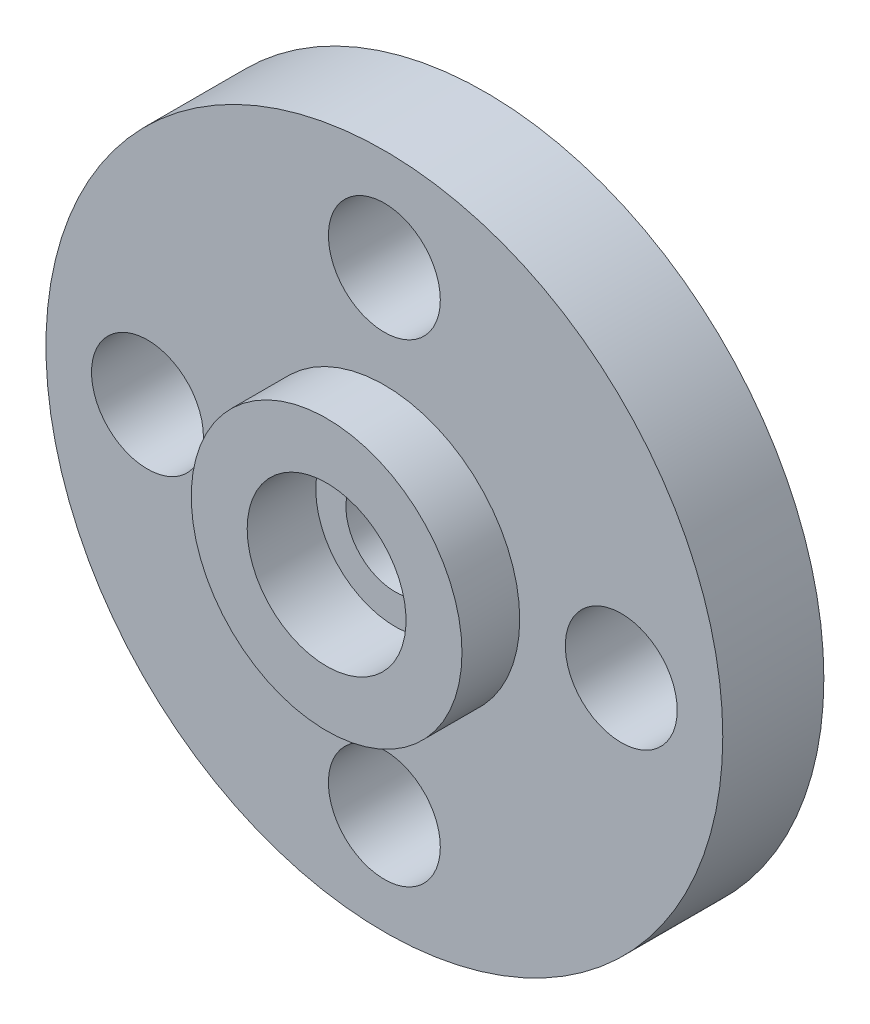
ISO-10303-21;
HEADER;
FILE_DESCRIPTION(('STEP AP214'),'2;1');
FILE_NAME('part.step','',(''),(''),'','','');
FILE_SCHEMA(('AUTOMOTIVE_DESIGN { 1 0 10303 214 1 1 1 1 }'));
ENDSEC;
DATA;
#1=APPLICATION_CONTEXT('core data for automotive mechanical design processes');
#2=APPLICATION_PROTOCOL_DEFINITION('international standard','automotive_design',2000,#1);
#3=PRODUCT_CONTEXT('',#1,'mechanical');
#4=PRODUCT('Part','Part','',(#3));
#5=PRODUCT_RELATED_PRODUCT_CATEGORY('part','',(#4));
#6=PRODUCT_DEFINITION_FORMATION('','',#4);
#7=PRODUCT_DEFINITION_CONTEXT('part definition',#1,'design');
#8=PRODUCT_DEFINITION('design','',#6,#7);
#9=PRODUCT_DEFINITION_SHAPE('','',#8);
#10=(LENGTH_UNIT() NAMED_UNIT(*) SI_UNIT(.MILLI.,.METRE.));
#11=(NAMED_UNIT(*) PLANE_ANGLE_UNIT() SI_UNIT($,.RADIAN.));
#12=(NAMED_UNIT(*) SI_UNIT($,.STERADIAN.) SOLID_ANGLE_UNIT());
#13=UNCERTAINTY_MEASURE_WITH_UNIT(LENGTH_MEASURE(1.E-05),#10,'distance_accuracy_value','');
#14=(GEOMETRIC_REPRESENTATION_CONTEXT(3) GLOBAL_UNCERTAINTY_ASSIGNED_CONTEXT((#13)) GLOBAL_UNIT_ASSIGNED_CONTEXT((#10,
#11,#12)) REPRESENTATION_CONTEXT('',''));
#15=CARTESIAN_POINT('',(0.,0.,0.));
#16=DIRECTION('',(0.,0.,1.));
#17=DIRECTION('',(1.,0.,0.));
#18=AXIS2_PLACEMENT_3D('',#15,#16,#17);
#19=CARTESIAN_POINT('',(0.,0.,0.));
#20=DIRECTION('',(0.,0.,1.));
#21=DIRECTION('',(1.,0.,0.));
#22=AXIS2_PLACEMENT_3D('',#19,#20,#21);
#23=PLANE('',#22);
#24=CARTESIAN_POINT('',(0.,0.,0.));
#25=DIRECTION('',(0.,0.,1.));
#26=DIRECTION('',(1.,0.,0.));
#27=AXIS2_PLACEMENT_3D('',#24,#25,#26);
#28=CIRCLE('',#27,17.526);
#29=CARTESIAN_POINT('',(17.526,0.,0.));
#30=VERTEX_POINT('',#29);
#31=EDGE_CURVE('E36',#30,#30,#28,.T.);
#32=ORIENTED_EDGE('',*,*,#31,.F.);
#33=EDGE_LOOP('',(#32));
#34=FACE_BOUND('',#33,.T.);
#35=CARTESIAN_POINT('',(0.,0.,0.));
#36=DIRECTION('',(0.,0.,1.));
#37=DIRECTION('',(1.,0.,0.));
#38=AXIS2_PLACEMENT_3D('',#35,#36,#37);
#39=CIRCLE('',#38,6.9342);
#40=CARTESIAN_POINT('',(6.9342,0.,0.));
#41=VERTEX_POINT('',#40);
#42=EDGE_CURVE('E84',#41,#41,#39,.T.);
#43=ORIENTED_EDGE('',*,*,#42,.T.);
#44=EDGE_LOOP('',(#43));
#45=FACE_BOUND('',#44,.T.);
#46=ADVANCED_FACE('F32',(#34,#45),#23,.F.);
#47=CARTESIAN_POINT('',(0.,0.,19.05));
#48=DIRECTION('',(0.,0.,-1.));
#49=DIRECTION('',(-1.,0.,0.));
#50=AXIS2_PLACEMENT_3D('',#47,#48,#49);
#51=PLANE('',#50);
#52=CARTESIAN_POINT('',(0.,0.,19.05));
#53=DIRECTION('',(0.,0.,-1.));
#54=DIRECTION('',(-1.,0.,0.));
#55=AXIS2_PLACEMENT_3D('',#52,#53,#54);
#56=CIRCLE('',#55,11.176);
#57=CARTESIAN_POINT('',(-11.176,0.,19.05));
#58=VERTEX_POINT('',#57);
#59=EDGE_CURVE('E80',#58,#58,#56,.T.);
#60=ORIENTED_EDGE('',*,*,#59,.F.);
#61=EDGE_LOOP('',(#60));
#62=FACE_BOUND('',#61,.T.);
#63=CARTESIAN_POINT('',(0.,0.,19.05));
#64=DIRECTION('',(0.,0.,-1.));
#65=DIRECTION('',(-1.,0.,0.));
#66=AXIS2_PLACEMENT_3D('',#63,#64,#65);
#67=CIRCLE('',#66,6.9342);
#68=CARTESIAN_POINT('',(6.9342,0.,19.05));
#69=VERTEX_POINT('',#68);
#70=EDGE_CURVE('E89',#69,#69,#67,.T.);
#71=ORIENTED_EDGE('',*,*,#70,.T.);
#72=EDGE_LOOP('',(#71));
#73=FACE_BOUND('',#72,.T.);
#74=ADVANCED_FACE('F93',(#62,#73),#51,.F.);
#75=CARTESIAN_POINT('',(0.,0.,28.702));
#76=DIRECTION('',(0.,0.,1.));
#77=DIRECTION('',(1.,0.,0.));
#78=AXIS2_PLACEMENT_3D('',#75,#76,#77);
#79=PLANE('',#78);
#80=CARTESIAN_POINT('',(0.,0.,28.702));
#81=DIRECTION('',(0.,0.,1.));
#82=DIRECTION('',(1.,0.,0.));
#83=AXIS2_PLACEMENT_3D('',#80,#81,#82);
#84=CIRCLE('',#83,19.05);
#85=CARTESIAN_POINT('',(19.05,0.,28.702));
#86=VERTEX_POINT('',#85);
#87=EDGE_CURVE('E48',#86,#86,#84,.T.);
#88=ORIENTED_EDGE('',*,*,#87,.T.);
#89=EDGE_LOOP('',(#88));
#90=FACE_BOUND('',#89,.T.);
#91=CARTESIAN_POINT('',(0.,0.,28.702));
#92=DIRECTION('',(0.,0.,-1.));
#93=DIRECTION('',(-1.,0.,0.));
#94=AXIS2_PLACEMENT_3D('',#91,#92,#93);
#95=CIRCLE('',#94,11.176);
#96=CARTESIAN_POINT('',(-11.176,0.,28.702));
#97=VERTEX_POINT('',#96);
#98=EDGE_CURVE('E81',#97,#97,#95,.T.);
#99=ORIENTED_EDGE('',*,*,#98,.T.);
#100=EDGE_LOOP('',(#99));
#101=FACE_BOUND('',#100,.T.);
#102=ADVANCED_FACE('F107',(#90,#101),#79,.T.);
#103=CARTESIAN_POINT('',(0.,0.,20.574));
#104=DIRECTION('',(0.,0.,1.));
#105=DIRECTION('',(1.,0.,0.));
#106=AXIS2_PLACEMENT_3D('',#103,#104,#105);
#107=PLANE('',#106);
#108=CARTESIAN_POINT('',(2.32794518267366E-13,-33.3375,20.574));
#109=DIRECTION('',(0.,0.,1.));
#110=DIRECTION('',(1.,0.,0.));
#111=AXIS2_PLACEMENT_3D('',#108,#109,#110);
#112=CIRCLE('',#111,7.874);
#113=CARTESIAN_POINT('',(7.87400000000023,-33.3375,20.574));
#114=VERTEX_POINT('',#113);
#115=EDGE_CURVE('E68',#114,#114,#112,.T.);
#116=ORIENTED_EDGE('',*,*,#115,.F.);
#117=EDGE_LOOP('',(#116));
#118=FACE_BOUND('',#117,.T.);
#119=CARTESIAN_POINT('',(0.,33.3375,20.574));
#120=DIRECTION('',(0.,0.,1.));
#121=DIRECTION('',(1.,0.,0.));
#122=AXIS2_PLACEMENT_3D('',#119,#120,#121);
#123=CIRCLE('',#122,7.874);
#124=CARTESIAN_POINT('',(7.874,33.3375,20.574));
#125=VERTEX_POINT('',#124);
#126=EDGE_CURVE('E54',#125,#125,#123,.T.);
#127=ORIENTED_EDGE('',*,*,#126,.F.);
#128=EDGE_LOOP('',(#127));
#129=FACE_BOUND('',#128,.T.);
#130=CARTESIAN_POINT('',(0.,0.,20.574));
#131=DIRECTION('',(0.,0.,1.));
#132=DIRECTION('',(1.,0.,0.));
#133=AXIS2_PLACEMENT_3D('',#130,#131,#132);
#134=CIRCLE('',#133,47.625);
#135=CARTESIAN_POINT('',(47.625,0.,20.574));
#136=VERTEX_POINT('',#135);
#137=EDGE_CURVE('E43',#136,#136,#134,.T.);
#138=ORIENTED_EDGE('',*,*,#137,.T.);
#139=EDGE_LOOP('',(#138));
#140=FACE_BOUND('',#139,.T.);
#141=CARTESIAN_POINT('',(0.,0.,20.574));
#142=DIRECTION('',(0.,0.,1.));
#143=DIRECTION('',(1.,0.,0.));
#144=AXIS2_PLACEMENT_3D('',#141,#142,#143);
#145=CIRCLE('',#144,19.05);
#146=CARTESIAN_POINT('',(19.05,0.,20.574));
#147=VERTEX_POINT('',#146);
#148=EDGE_CURVE('E51',#147,#147,#145,.T.);
#149=ORIENTED_EDGE('',*,*,#148,.F.);
#150=EDGE_LOOP('',(#149));
#151=FACE_BOUND('',#150,.T.);
#152=CARTESIAN_POINT('',(-33.3375,-1.16397259133683E-13,20.574));
#153=DIRECTION('',(0.,0.,1.));
#154=DIRECTION('',(1.,0.,0.));
#155=AXIS2_PLACEMENT_3D('',#152,#153,#154);
#156=CIRCLE('',#155,7.874);
#157=CARTESIAN_POINT('',(-25.4635,-1.16397259133683E-13,20.574));
#158=VERTEX_POINT('',#157);
#159=EDGE_CURVE('E62',#158,#158,#156,.T.);
#160=ORIENTED_EDGE('',*,*,#159,.F.);
#161=EDGE_LOOP('',(#160));
#162=FACE_BOUND('',#161,.T.);
#163=CARTESIAN_POINT('',(33.3375,3.49191777401049E-13,20.574));
#164=DIRECTION('',(0.,0.,1.));
#165=DIRECTION('',(1.,0.,0.));
#166=AXIS2_PLACEMENT_3D('',#163,#164,#165);
#167=CIRCLE('',#166,7.874);
#168=CARTESIAN_POINT('',(41.2115,3.49191777401049E-13,20.574));
#169=VERTEX_POINT('',#168);
#170=EDGE_CURVE('E74',#169,#169,#167,.T.);
#171=ORIENTED_EDGE('',*,*,#170,.F.);
#172=EDGE_LOOP('',(#171));
#173=FACE_BOUND('',#172,.T.);
#174=ADVANCED_FACE('F120',(#118,#129,#140,#151,#162,#173),#107,.T.);
#175=CARTESIAN_POINT('',(0.,0.,6.35));
#176=DIRECTION('',(0.,0.,1.));
#177=DIRECTION('',(1.,0.,0.));
#178=AXIS2_PLACEMENT_3D('',#175,#176,#177);
#179=PLANE('',#178);
#180=CARTESIAN_POINT('',(2.32794518267366E-13,-33.3375,6.35));
#181=DIRECTION('',(0.,0.,1.));
#182=DIRECTION('',(1.,0.,0.));
#183=AXIS2_PLACEMENT_3D('',#180,#181,#182);
#184=CIRCLE('',#183,7.874);
#185=CARTESIAN_POINT('',(7.87400000000023,-33.3375,6.35));
#186=VERTEX_POINT('',#185);
#187=EDGE_CURVE('E71',#186,#186,#184,.T.);
#188=ORIENTED_EDGE('',*,*,#187,.T.);
#189=EDGE_LOOP('',(#188));
#190=FACE_BOUND('',#189,.T.);
#191=CARTESIAN_POINT('',(0.,33.3375,6.35));
#192=DIRECTION('',(0.,0.,1.));
#193=DIRECTION('',(1.,0.,0.));
#194=AXIS2_PLACEMENT_3D('',#191,#192,#193);
#195=CIRCLE('',#194,7.874);
#196=CARTESIAN_POINT('',(7.874,33.3375,6.35));
#197=VERTEX_POINT('',#196);
#198=EDGE_CURVE('E59',#197,#197,#195,.T.);
#199=ORIENTED_EDGE('',*,*,#198,.T.);
#200=EDGE_LOOP('',(#199));
#201=FACE_BOUND('',#200,.T.);
#202=CARTESIAN_POINT('',(0.,0.,6.35));
#203=DIRECTION('',(0.,0.,1.));
#204=DIRECTION('',(1.,0.,0.));
#205=AXIS2_PLACEMENT_3D('',#202,#203,#204);
#206=CIRCLE('',#205,47.625);
#207=CARTESIAN_POINT('',(47.625,0.,6.35));
#208=VERTEX_POINT('',#207);
#209=EDGE_CURVE('E45',#208,#208,#206,.T.);
#210=ORIENTED_EDGE('',*,*,#209,.F.);
#211=EDGE_LOOP('',(#210));
#212=FACE_BOUND('',#211,.T.);
#213=CARTESIAN_POINT('',(0.,0.,6.35));
#214=DIRECTION('',(0.,0.,1.));
#215=DIRECTION('',(1.,0.,0.));
#216=AXIS2_PLACEMENT_3D('',#213,#214,#215);
#217=CIRCLE('',#216,17.526);
#218=CARTESIAN_POINT('',(17.526,0.,6.35));
#219=VERTEX_POINT('',#218);
#220=EDGE_CURVE('E10',#219,#219,#217,.T.);
#221=ORIENTED_EDGE('',*,*,#220,.T.);
#222=EDGE_LOOP('',(#221));
#223=FACE_BOUND('',#222,.T.);
#224=CARTESIAN_POINT('',(-33.3375,-1.16397259133683E-13,6.35));
#225=DIRECTION('',(0.,0.,1.));
#226=DIRECTION('',(1.,0.,0.));
#227=AXIS2_PLACEMENT_3D('',#224,#225,#226);
#228=CIRCLE('',#227,7.874);
#229=CARTESIAN_POINT('',(-25.4635,-1.16397259133683E-13,6.35));
#230=VERTEX_POINT('',#229);
#231=EDGE_CURVE('E65',#230,#230,#228,.T.);
#232=ORIENTED_EDGE('',*,*,#231,.T.);
#233=EDGE_LOOP('',(#232));
#234=FACE_BOUND('',#233,.T.);
#235=CARTESIAN_POINT('',(33.3375,3.49191777401049E-13,6.35));
#236=DIRECTION('',(0.,0.,1.));
#237=DIRECTION('',(1.,0.,0.));
#238=AXIS2_PLACEMENT_3D('',#235,#236,#237);
#239=CIRCLE('',#238,7.874);
#240=CARTESIAN_POINT('',(41.2115,3.49191777401049E-13,6.35));
#241=VERTEX_POINT('',#240);
#242=EDGE_CURVE('E77',#241,#241,#239,.T.);
#243=ORIENTED_EDGE('',*,*,#242,.T.);
#244=EDGE_LOOP('',(#243));
#245=FACE_BOUND('',#244,.T.);
#246=ADVANCED_FACE('F117',(#190,#201,#212,#223,#234,#245),#179,.F.);
#247=CARTESIAN_POINT('',(0.,0.,6.35));
#248=DIRECTION('',(0.,0.,-1.));
#249=DIRECTION('',(-1.,0.,0.));
#250=AXIS2_PLACEMENT_3D('',#247,#248,#249);
#251=CYLINDRICAL_SURFACE('',#250,17.526);
#252=ORIENTED_EDGE('',*,*,#220,.F.);
#253=EDGE_LOOP('',(#252));
#254=FACE_BOUND('',#253,.T.);
#255=ORIENTED_EDGE('',*,*,#31,.T.);
#256=EDGE_LOOP('',(#255));
#257=FACE_BOUND('',#256,.T.);
#258=ADVANCED_FACE('F34',(#254,#257),#251,.T.);
#259=CARTESIAN_POINT('',(0.,0.,20.574));
#260=DIRECTION('',(0.,0.,-1.));
#261=DIRECTION('',(-1.,0.,0.));
#262=AXIS2_PLACEMENT_3D('',#259,#260,#261);
#263=CYLINDRICAL_SURFACE('',#262,47.625);
#264=ORIENTED_EDGE('',*,*,#137,.F.);
#265=EDGE_LOOP('',(#264));
#266=FACE_BOUND('',#265,.T.);
#267=ORIENTED_EDGE('',*,*,#209,.T.);
#268=EDGE_LOOP('',(#267));
#269=FACE_BOUND('',#268,.T.);
#270=ADVANCED_FACE('F112',(#266,#269),#263,.T.);
#271=CARTESIAN_POINT('',(0.,0.,28.702));
#272=DIRECTION('',(0.,0.,-1.));
#273=DIRECTION('',(-1.,0.,0.));
#274=AXIS2_PLACEMENT_3D('',#271,#272,#273);
#275=CYLINDRICAL_SURFACE('',#274,19.05);
#276=ORIENTED_EDGE('',*,*,#87,.F.);
#277=EDGE_LOOP('',(#276));
#278=FACE_BOUND('',#277,.T.);
#279=ORIENTED_EDGE('',*,*,#148,.T.);
#280=EDGE_LOOP('',(#279));
#281=FACE_BOUND('',#280,.T.);
#282=ADVANCED_FACE('F115',(#278,#281),#275,.T.);
#283=CARTESIAN_POINT('',(0.,33.3375,42.8450351802515));
#284=DIRECTION('',(0.,0.,-1.));
#285=DIRECTION('',(-1.,0.,0.));
#286=AXIS2_PLACEMENT_3D('',#283,#284,#285);
#287=CYLINDRICAL_SURFACE('',#286,7.874);
#288=ORIENTED_EDGE('',*,*,#198,.F.);
#289=EDGE_LOOP('',(#288));
#290=FACE_BOUND('',#289,.T.);
#291=ORIENTED_EDGE('',*,*,#126,.T.);
#292=EDGE_LOOP('',(#291));
#293=FACE_BOUND('',#292,.T.);
#294=ADVANCED_FACE('F127',(#290,#293),#287,.F.);
#295=CARTESIAN_POINT('',(-33.3375,-1.16397259133683E-13,42.8450351802515));
#296=DIRECTION('',(0.,0.,-1.));
#297=DIRECTION('',(-1.,0.,0.));
#298=AXIS2_PLACEMENT_3D('',#295,#296,#297);
#299=CYLINDRICAL_SURFACE('',#298,7.874);
#300=ORIENTED_EDGE('',*,*,#231,.F.);
#301=EDGE_LOOP('',(#300));
#302=FACE_BOUND('',#301,.T.);
#303=ORIENTED_EDGE('',*,*,#159,.T.);
#304=EDGE_LOOP('',(#303));
#305=FACE_BOUND('',#304,.T.);
#306=ADVANCED_FACE('F134',(#302,#305),#299,.F.);
#307=CARTESIAN_POINT('',(2.32794518267366E-13,-33.3375,42.8450351802515));
#308=DIRECTION('',(0.,0.,-1.));
#309=DIRECTION('',(-1.,0.,0.));
#310=AXIS2_PLACEMENT_3D('',#307,#308,#309);
#311=CYLINDRICAL_SURFACE('',#310,7.874);
#312=ORIENTED_EDGE('',*,*,#187,.F.);
#313=EDGE_LOOP('',(#312));
#314=FACE_BOUND('',#313,.T.);
#315=ORIENTED_EDGE('',*,*,#115,.T.);
#316=EDGE_LOOP('',(#315));
#317=FACE_BOUND('',#316,.T.);
#318=ADVANCED_FACE('F138',(#314,#317),#311,.F.);
#319=CARTESIAN_POINT('',(33.3375,3.49191777401049E-13,42.8450351802515));
#320=DIRECTION('',(0.,0.,-1.));
#321=DIRECTION('',(-1.,0.,0.));
#322=AXIS2_PLACEMENT_3D('',#319,#320,#321);
#323=CYLINDRICAL_SURFACE('',#322,7.874);
#324=ORIENTED_EDGE('',*,*,#242,.F.);
#325=EDGE_LOOP('',(#324));
#326=FACE_BOUND('',#325,.T.);
#327=ORIENTED_EDGE('',*,*,#170,.T.);
#328=EDGE_LOOP('',(#327));
#329=FACE_BOUND('',#328,.T.);
#330=ADVANCED_FACE('F142',(#326,#329),#323,.F.);
#331=CARTESIAN_POINT('',(0.,0.,19.05));
#332=DIRECTION('',(0.,0.,1.));
#333=DIRECTION('',(1.,0.,0.));
#334=AXIS2_PLACEMENT_3D('',#331,#332,#333);
#335=CYLINDRICAL_SURFACE('',#334,11.176);
#336=ORIENTED_EDGE('',*,*,#59,.T.);
#337=EDGE_LOOP('',(#336));
#338=FACE_BOUND('',#337,.T.);
#339=ORIENTED_EDGE('',*,*,#98,.F.);
#340=EDGE_LOOP('',(#339));
#341=FACE_BOUND('',#340,.T.);
#342=ADVANCED_FACE('F98',(#338,#341),#335,.F.);
#343=CARTESIAN_POINT('',(0.,0.,-0.001000000000001));
#344=DIRECTION('',(0.,0.,1.));
#345=DIRECTION('',(1.,0.,0.));
#346=AXIS2_PLACEMENT_3D('',#343,#344,#345);
#347=CYLINDRICAL_SURFACE('',#346,6.9342);
#348=CARTESIAN_POINT('',(6.9342,0.,19.05));
#349=CARTESIAN_POINT('',(6.9342,0.,18.8515625));
#350=CARTESIAN_POINT('',(6.9342,0.,18.653125));
#351=CARTESIAN_POINT('',(6.9342,0.,18.25625));
#352=CARTESIAN_POINT('',(6.9342,0.,18.0578125));
#353=CARTESIAN_POINT('',(6.9342,0.,17.6609375));
#354=CARTESIAN_POINT('',(6.9342,0.,17.4625));
#355=CARTESIAN_POINT('',(6.9342,0.,17.065625));
#356=CARTESIAN_POINT('',(6.9342,0.,16.8671875));
#357=CARTESIAN_POINT('',(6.9342,0.,16.4703125));
#358=CARTESIAN_POINT('',(6.9342,0.,16.271875));
#359=CARTESIAN_POINT('',(6.9342,0.,15.875));
#360=CARTESIAN_POINT('',(6.9342,0.,15.6765625));
#361=CARTESIAN_POINT('',(6.9342,0.,15.2796875));
#362=CARTESIAN_POINT('',(6.9342,0.,15.08125));
#363=CARTESIAN_POINT('',(6.9342,0.,14.684375));
#364=CARTESIAN_POINT('',(6.9342,0.,14.4859375));
#365=CARTESIAN_POINT('',(6.9342,0.,14.0890625));
#366=CARTESIAN_POINT('',(6.9342,0.,13.890625));
#367=CARTESIAN_POINT('',(6.9342,0.,13.49375));
#368=CARTESIAN_POINT('',(6.9342,0.,13.2953125));
#369=CARTESIAN_POINT('',(6.9342,0.,12.8984375));
#370=CARTESIAN_POINT('',(6.9342,0.,12.7));
#371=CARTESIAN_POINT('',(6.9342,0.,12.303125));
#372=CARTESIAN_POINT('',(6.9342,0.,12.1046875));
#373=CARTESIAN_POINT('',(6.9342,0.,11.7078125));
#374=CARTESIAN_POINT('',(6.9342,0.,11.509375));
#375=CARTESIAN_POINT('',(6.9342,0.,11.1125));
#376=CARTESIAN_POINT('',(6.9342,0.,10.9140625));
#377=CARTESIAN_POINT('',(6.9342,0.,10.5171875));
#378=CARTESIAN_POINT('',(6.9342,0.,10.31875));
#379=CARTESIAN_POINT('',(6.9342,0.,9.921875));
#380=CARTESIAN_POINT('',(6.9342,0.,9.7234375));
#381=CARTESIAN_POINT('',(6.9342,0.,9.3265625));
#382=CARTESIAN_POINT('',(6.9342,0.,9.128125));
#383=CARTESIAN_POINT('',(6.9342,0.,8.73125));
#384=CARTESIAN_POINT('',(6.9342,0.,8.5328125));
#385=CARTESIAN_POINT('',(6.9342,0.,8.1359375));
#386=CARTESIAN_POINT('',(6.9342,0.,7.9375));
#387=CARTESIAN_POINT('',(6.9342,0.,7.540625));
#388=CARTESIAN_POINT('',(6.9342,0.,7.3421875));
#389=CARTESIAN_POINT('',(6.9342,0.,6.9453125));
#390=CARTESIAN_POINT('',(6.9342,0.,6.746875));
#391=CARTESIAN_POINT('',(6.9342,0.,6.35));
#392=CARTESIAN_POINT('',(6.9342,0.,6.1515625));
#393=CARTESIAN_POINT('',(6.9342,0.,5.7546875));
#394=CARTESIAN_POINT('',(6.9342,0.,5.55625));
#395=CARTESIAN_POINT('',(6.9342,0.,5.159375));
#396=CARTESIAN_POINT('',(6.9342,0.,4.9609375));
#397=CARTESIAN_POINT('',(6.9342,0.,4.5640625));
#398=CARTESIAN_POINT('',(6.9342,0.,4.365625));
#399=CARTESIAN_POINT('',(6.9342,0.,3.96875));
#400=CARTESIAN_POINT('',(6.9342,0.,3.7703125));
#401=CARTESIAN_POINT('',(6.9342,0.,3.3734375));
#402=CARTESIAN_POINT('',(6.9342,0.,3.175));
#403=CARTESIAN_POINT('',(6.9342,0.,2.778125));
#404=CARTESIAN_POINT('',(6.9342,0.,2.5796875));
#405=CARTESIAN_POINT('',(6.9342,0.,2.1828125));
#406=CARTESIAN_POINT('',(6.9342,0.,1.984375));
#407=CARTESIAN_POINT('',(6.9342,0.,1.5875));
#408=CARTESIAN_POINT('',(6.9342,0.,1.3890625));
#409=CARTESIAN_POINT('',(6.9342,0.,0.9921875));
#410=CARTESIAN_POINT('',(6.9342,0.,0.79375));
#411=CARTESIAN_POINT('',(6.9342,0.,0.396875));
#412=CARTESIAN_POINT('',(6.9342,0.,0.1984375));
#413=CARTESIAN_POINT('',(6.9342,0.,0.));
#414=B_SPLINE_CURVE_WITH_KNOTS('',3,(#348,#349,#350,#351,#352,#353,#354,#355,#356,#357,#358,
#359,#360,#361,#362,#363,#364,#365,#366,#367,#368,#369,#370,#371,#372,#373,#374,#375,#376,#377,
#378,#379,#380,#381,#382,#383,#384,#385,#386,#387,#388,#389,#390,#391,#392,#393,#394,#395,#396,
#397,#398,#399,#400,#401,#402,#403,#404,#405,#406,#407,#408,#409,#410,#411,#412,#413),
.UNSPECIFIED.,.F.,.F.,(4,2,2,2,2,2,2,2,2,2,2,2,2,2,2,2,2,2,2,2,2,2,2,2,2,2,2,2,2,2,2,2,4),(0.,
0.5953125,1.190625,1.7859375,2.38125,2.9765625,3.571875,4.1671875,4.7625,5.3578125,5.953125,
6.5484375,7.14375,7.7390625,8.334375,8.9296875,9.525,10.1203125,10.715625,11.3109375,11.90625,
12.5015625,13.096875,13.6921875,14.2875,14.8828125,15.478125,16.0734375,16.66875,17.2640625,
17.859375,18.4546875,19.05),.UNSPECIFIED.);
#415=EDGE_CURVE('BSEAM95',#69,#41,#414,.T.);
#416=ORIENTED_EDGE('',*,*,#70,.F.);
#417=ORIENTED_EDGE('',*,*,#42,.F.);
#418=ORIENTED_EDGE('',*,*,#415,.T.);
#419=ORIENTED_EDGE('',*,*,#415,.F.);
#420=EDGE_LOOP('',(#416,#418,#417,#419));
#421=FACE_BOUND('',#420,.T.);
#422=ADVANCED_FACE('F95',(#421),#347,.F.);
#423=CLOSED_SHELL('',(#46,#74,#102,#174,#246,#258,#270,#282,#294,#306,#318,#330,#342,#422));
#424=MANIFOLD_SOLID_BREP('B2',#423);
#425=ADVANCED_BREP_SHAPE_REPRESENTATION('',(#18,#424),#14);
#426=SHAPE_DEFINITION_REPRESENTATION(#9,#425);
ENDSEC;
END-ISO-10303-21;
